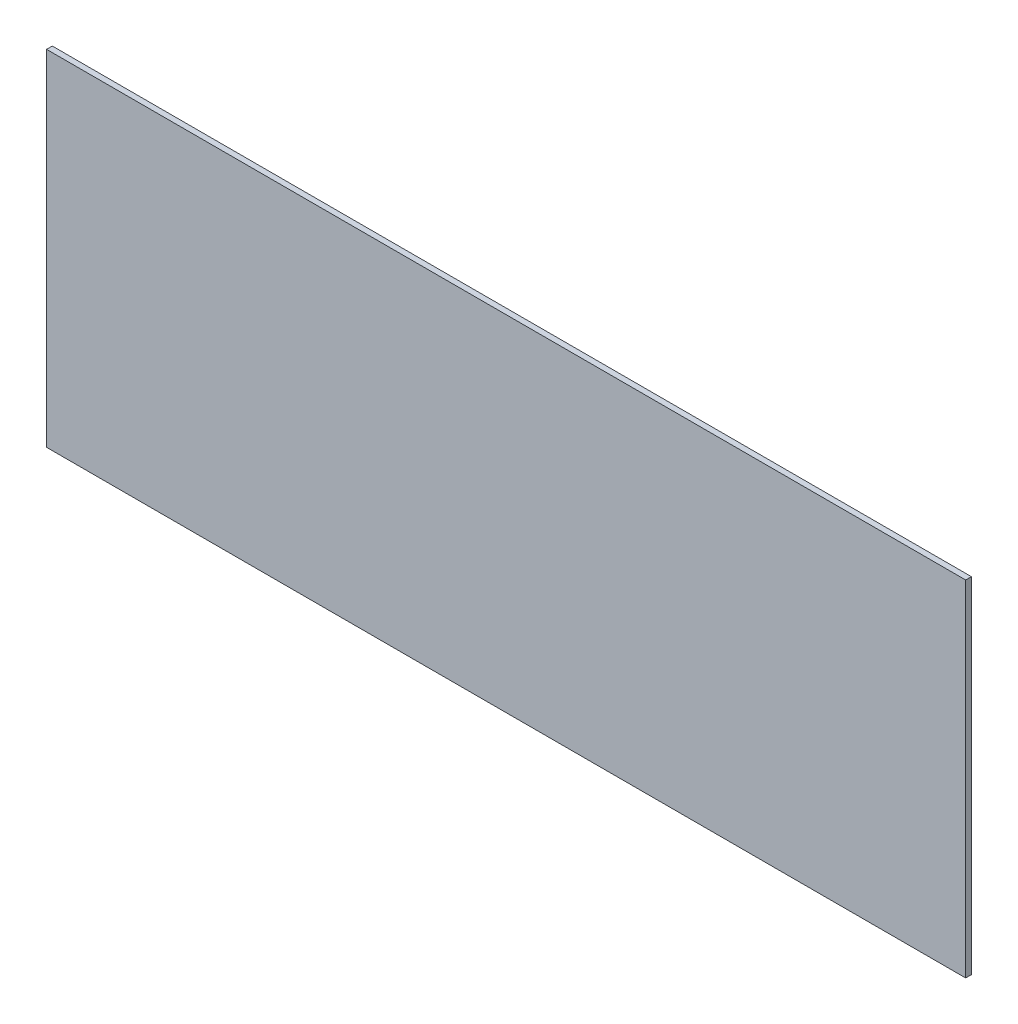
ISO-10303-21;
HEADER;
FILE_DESCRIPTION(('STEP AP214'),'2;1');
FILE_NAME('part.step','',(''),(''),'','','');
FILE_SCHEMA(('AUTOMOTIVE_DESIGN { 1 0 10303 214 1 1 1 1 }'));
ENDSEC;
DATA;
#1=APPLICATION_CONTEXT('core data for automotive mechanical design processes');
#2=APPLICATION_PROTOCOL_DEFINITION('international standard','automotive_design',2000,#1);
#3=PRODUCT_CONTEXT('',#1,'mechanical');
#4=PRODUCT('Part','Part','',(#3));
#5=PRODUCT_RELATED_PRODUCT_CATEGORY('part','',(#4));
#6=PRODUCT_DEFINITION_FORMATION('','',#4);
#7=PRODUCT_DEFINITION_CONTEXT('part definition',#1,'design');
#8=PRODUCT_DEFINITION('design','',#6,#7);
#9=PRODUCT_DEFINITION_SHAPE('','',#8);
#10=(LENGTH_UNIT() NAMED_UNIT(*) SI_UNIT(.MILLI.,.METRE.));
#11=(NAMED_UNIT(*) PLANE_ANGLE_UNIT() SI_UNIT($,.RADIAN.));
#12=(NAMED_UNIT(*) SI_UNIT($,.STERADIAN.) SOLID_ANGLE_UNIT());
#13=UNCERTAINTY_MEASURE_WITH_UNIT(LENGTH_MEASURE(1.E-05),#10,'distance_accuracy_value','');
#14=(GEOMETRIC_REPRESENTATION_CONTEXT(3) GLOBAL_UNCERTAINTY_ASSIGNED_CONTEXT((#13)) GLOBAL_UNIT_ASSIGNED_CONTEXT((#10,
#11,#12)) REPRESENTATION_CONTEXT('',''));
#15=CARTESIAN_POINT('',(0.,0.,0.));
#16=DIRECTION('',(0.,0.,1.));
#17=DIRECTION('',(1.,0.,0.));
#18=AXIS2_PLACEMENT_3D('',#15,#16,#17);
#19=CARTESIAN_POINT('',(0.,0.,2.54));
#20=DIRECTION('',(1.,0.,0.));
#21=DIRECTION('',(0.,0.,-1.));
#22=AXIS2_PLACEMENT_3D('',#19,#20,#21);
#23=PLANE('',#22);
#24=DIRECTION('',(0.,-1.,0.));
#25=VECTOR('',#24,1.);
#26=CARTESIAN_POINT('',(0.,0.,0.));
#27=LINE('',#26,#25);
#28=CARTESIAN_POINT('',(0.,152.4,0.));
#29=VERTEX_POINT('',#28);
#30=CARTESIAN_POINT('',(0.,0.,0.));
#31=VERTEX_POINT('',#30);
#32=EDGE_CURVE('E107',#29,#31,#27,.T.);
#33=ORIENTED_EDGE('',*,*,#32,.T.);
#34=DIRECTION('',(0.,0.,-1.));
#35=VECTOR('',#34,1.);
#36=CARTESIAN_POINT('',(0.,0.,2.54));
#37=LINE('',#36,#35);
#38=CARTESIAN_POINT('',(0.,0.,2.54));
#39=VERTEX_POINT('',#38);
#40=EDGE_CURVE('E11',#39,#31,#37,.T.);
#41=ORIENTED_EDGE('',*,*,#40,.F.);
#42=DIRECTION('',(0.,-1.,0.));
#43=VECTOR('',#42,1.);
#44=CARTESIAN_POINT('',(0.,0.,2.54));
#45=LINE('',#44,#43);
#46=CARTESIAN_POINT('',(0.,152.4,2.54));
#47=VERTEX_POINT('',#46);
#48=EDGE_CURVE('E91',#47,#39,#45,.T.);
#49=ORIENTED_EDGE('',*,*,#48,.F.);
#50=DIRECTION('',(0.,0.,-1.));
#51=VECTOR('',#50,1.);
#52=CARTESIAN_POINT('',(0.,152.4,2.54));
#53=LINE('',#52,#51);
#54=EDGE_CURVE('E103',#47,#29,#53,.T.);
#55=ORIENTED_EDGE('',*,*,#54,.T.);
#56=EDGE_LOOP('',(#33,#41,#49,#55));
#57=FACE_BOUND('',#56,.T.);
#58=ADVANCED_FACE('F39',(#57),#23,.F.);
#59=CARTESIAN_POINT('',(0.,0.,2.54));
#60=DIRECTION('',(0.,1.,0.));
#61=DIRECTION('',(0.,0.,1.));
#62=AXIS2_PLACEMENT_3D('',#59,#60,#61);
#63=PLANE('',#62);
#64=DIRECTION('',(1.,0.,0.));
#65=VECTOR('',#64,1.);
#66=CARTESIAN_POINT('',(0.,0.,0.));
#67=LINE('',#66,#65);
#68=CARTESIAN_POINT('',(406.4,0.,0.));
#69=VERTEX_POINT('',#68);
#70=EDGE_CURVE('E96',#31,#69,#67,.T.);
#71=ORIENTED_EDGE('',*,*,#70,.T.);
#72=DIRECTION('',(0.,0.,-1.));
#73=VECTOR('',#72,1.);
#74=CARTESIAN_POINT('',(406.4,0.,2.54));
#75=LINE('',#74,#73);
#76=CARTESIAN_POINT('',(406.4,0.,2.54));
#77=VERTEX_POINT('',#76);
#78=EDGE_CURVE('E48',#77,#69,#75,.T.);
#79=ORIENTED_EDGE('',*,*,#78,.F.);
#80=DIRECTION('',(1.,0.,0.));
#81=VECTOR('',#80,1.);
#82=CARTESIAN_POINT('',(0.,0.,2.54));
#83=LINE('',#82,#81);
#84=EDGE_CURVE('E86',#39,#77,#83,.T.);
#85=ORIENTED_EDGE('',*,*,#84,.F.);
#86=ORIENTED_EDGE('',*,*,#40,.T.);
#87=EDGE_LOOP('',(#71,#79,#85,#86));
#88=FACE_BOUND('',#87,.T.);
#89=ADVANCED_FACE('F95',(#88),#63,.F.);
#90=CARTESIAN_POINT('',(406.4,0.,2.54));
#91=DIRECTION('',(-1.,0.,0.));
#92=DIRECTION('',(0.,0.,1.));
#93=AXIS2_PLACEMENT_3D('',#90,#91,#92);
#94=PLANE('',#93);
#95=DIRECTION('',(0.,1.,0.));
#96=VECTOR('',#95,1.);
#97=CARTESIAN_POINT('',(406.4,0.,0.));
#98=LINE('',#97,#96);
#99=CARTESIAN_POINT('',(406.4,152.4,0.));
#100=VERTEX_POINT('',#99);
#101=EDGE_CURVE('E73',#69,#100,#98,.T.);
#102=ORIENTED_EDGE('',*,*,#101,.T.);
#103=DIRECTION('',(0.,0.,-1.));
#104=VECTOR('',#103,1.);
#105=CARTESIAN_POINT('',(406.4,152.4,2.54));
#106=LINE('',#105,#104);
#107=CARTESIAN_POINT('',(406.4,152.4,2.54));
#108=VERTEX_POINT('',#107);
#109=EDGE_CURVE('E98',#108,#100,#106,.T.);
#110=ORIENTED_EDGE('',*,*,#109,.F.);
#111=DIRECTION('',(0.,1.,0.));
#112=VECTOR('',#111,1.);
#113=CARTESIAN_POINT('',(406.4,0.,2.54));
#114=LINE('',#113,#112);
#115=EDGE_CURVE('E89',#77,#108,#114,.T.);
#116=ORIENTED_EDGE('',*,*,#115,.F.);
#117=ORIENTED_EDGE('',*,*,#78,.T.);
#118=EDGE_LOOP('',(#102,#110,#116,#117));
#119=FACE_BOUND('',#118,.T.);
#120=ADVANCED_FACE('F99',(#119),#94,.F.);
#121=CARTESIAN_POINT('',(0.,152.4,2.54));
#122=DIRECTION('',(0.,-1.,0.));
#123=DIRECTION('',(0.,0.,-1.));
#124=AXIS2_PLACEMENT_3D('',#121,#122,#123);
#125=PLANE('',#124);
#126=DIRECTION('',(-1.,0.,0.));
#127=VECTOR('',#126,1.);
#128=CARTESIAN_POINT('',(0.,152.4,0.));
#129=LINE('',#128,#127);
#130=EDGE_CURVE('E79',#100,#29,#129,.T.);
#131=ORIENTED_EDGE('',*,*,#130,.T.);
#132=ORIENTED_EDGE('',*,*,#54,.F.);
#133=DIRECTION('',(-1.,0.,0.));
#134=VECTOR('',#133,1.);
#135=CARTESIAN_POINT('',(0.,152.4,2.54));
#136=LINE('',#135,#134);
#137=EDGE_CURVE('E56',#108,#47,#136,.T.);
#138=ORIENTED_EDGE('',*,*,#137,.F.);
#139=ORIENTED_EDGE('',*,*,#109,.T.);
#140=EDGE_LOOP('',(#131,#132,#138,#139));
#141=FACE_BOUND('',#140,.T.);
#142=ADVANCED_FACE('F120',(#141),#125,.F.);
#143=CARTESIAN_POINT('',(0.,0.,2.54));
#144=DIRECTION('',(0.,0.,-1.));
#145=DIRECTION('',(-1.,0.,0.));
#146=AXIS2_PLACEMENT_3D('',#143,#144,#145);
#147=PLANE('',#146);
#148=ORIENTED_EDGE('',*,*,#48,.T.);
#149=ORIENTED_EDGE('',*,*,#84,.T.);
#150=ORIENTED_EDGE('',*,*,#115,.T.);
#151=ORIENTED_EDGE('',*,*,#137,.T.);
#152=EDGE_LOOP('',(#148,#149,#150,#151));
#153=FACE_BOUND('',#152,.T.);
#154=ADVANCED_FACE('F87',(#153),#147,.F.);
#155=CARTESIAN_POINT('',(0.,0.,0.));
#156=DIRECTION('',(0.,0.,-1.));
#157=DIRECTION('',(-1.,0.,0.));
#158=AXIS2_PLACEMENT_3D('',#155,#156,#157);
#159=PLANE('',#158);
#160=ORIENTED_EDGE('',*,*,#32,.F.);
#161=ORIENTED_EDGE('',*,*,#130,.F.);
#162=ORIENTED_EDGE('',*,*,#101,.F.);
#163=ORIENTED_EDGE('',*,*,#70,.F.);
#164=EDGE_LOOP('',(#160,#161,#162,#163));
#165=FACE_BOUND('',#164,.T.);
#166=ADVANCED_FACE('F123',(#165),#159,.T.);
#167=CLOSED_SHELL('',(#58,#89,#120,#142,#154,#166));
#168=MANIFOLD_SOLID_BREP('B2',#167);
#169=ADVANCED_BREP_SHAPE_REPRESENTATION('',(#18,#168),#14);
#170=SHAPE_DEFINITION_REPRESENTATION(#9,#169);
ENDSEC;
END-ISO-10303-21;
